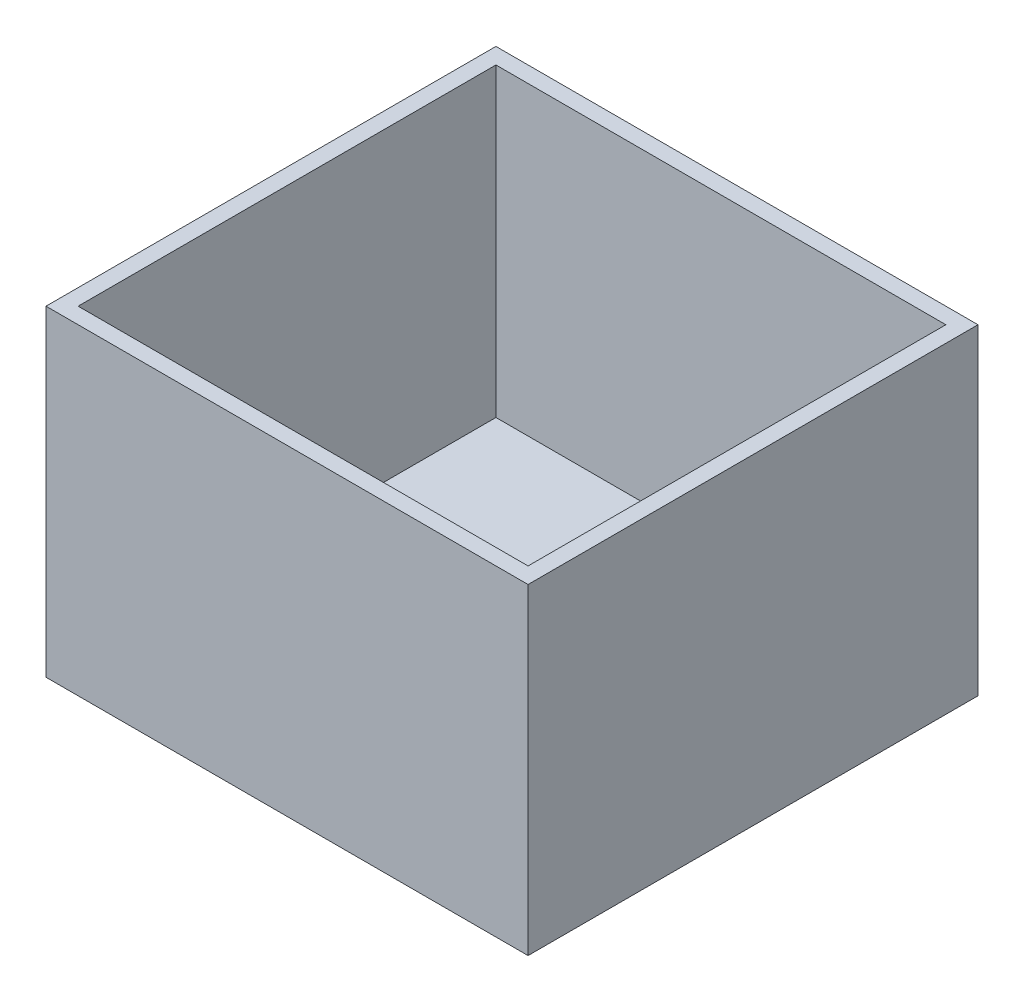
ISO-10303-21;
HEADER;
FILE_DESCRIPTION(('STEP AP214'),'2;1');
FILE_NAME('part.step','',(''),(''),'','','');
FILE_SCHEMA(('AUTOMOTIVE_DESIGN { 1 0 10303 214 1 1 1 1 }'));
ENDSEC;
DATA;
#1=APPLICATION_CONTEXT('core data for automotive mechanical design processes');
#2=APPLICATION_PROTOCOL_DEFINITION('international standard','automotive_design',2000,#1);
#3=PRODUCT_CONTEXT('',#1,'mechanical');
#4=PRODUCT('Part','Part','',(#3));
#5=PRODUCT_RELATED_PRODUCT_CATEGORY('part','',(#4));
#6=PRODUCT_DEFINITION_FORMATION('','',#4);
#7=PRODUCT_DEFINITION_CONTEXT('part definition',#1,'design');
#8=PRODUCT_DEFINITION('design','',#6,#7);
#9=PRODUCT_DEFINITION_SHAPE('','',#8);
#10=(LENGTH_UNIT() NAMED_UNIT(*) SI_UNIT(.MILLI.,.METRE.));
#11=(NAMED_UNIT(*) PLANE_ANGLE_UNIT() SI_UNIT($,.RADIAN.));
#12=(NAMED_UNIT(*) SI_UNIT($,.STERADIAN.) SOLID_ANGLE_UNIT());
#13=UNCERTAINTY_MEASURE_WITH_UNIT(LENGTH_MEASURE(1.E-05),#10,'distance_accuracy_value','');
#14=(GEOMETRIC_REPRESENTATION_CONTEXT(3) GLOBAL_UNCERTAINTY_ASSIGNED_CONTEXT((#13)) GLOBAL_UNIT_ASSIGNED_CONTEXT((#10,
#11,#12)) REPRESENTATION_CONTEXT('',''));
#15=CARTESIAN_POINT('',(0.,0.,0.));
#16=DIRECTION('',(0.,0.,1.));
#17=DIRECTION('',(1.,0.,0.));
#18=AXIS2_PLACEMENT_3D('',#15,#16,#17);
#19=CARTESIAN_POINT('',(0.,25.4,0.));
#20=DIRECTION('',(0.,1.,0.));
#21=DIRECTION('',(0.,0.,1.));
#22=AXIS2_PLACEMENT_3D('',#19,#20,#21);
#23=PLANE('',#22);
#24=DIRECTION('',(1.,0.,0.));
#25=VECTOR('',#24,1.);
#26=CARTESIAN_POINT('',(0.,25.4,-35.56));
#27=LINE('',#26,#25);
#28=CARTESIAN_POINT('',(-38.1,25.4,-35.56));
#29=VERTEX_POINT('',#28);
#30=CARTESIAN_POINT('',(38.1,25.4,-35.56));
#31=VERTEX_POINT('',#30);
#32=EDGE_CURVE('E172',#29,#31,#27,.T.);
#33=ORIENTED_EDGE('',*,*,#32,.F.);
#34=DIRECTION('',(0.,0.,1.));
#35=VECTOR('',#34,1.);
#36=CARTESIAN_POINT('',(-38.1,25.4,0.));
#37=LINE('',#36,#35);
#38=CARTESIAN_POINT('',(-38.1,25.4,35.56));
#39=VERTEX_POINT('',#38);
#40=EDGE_CURVE('E175',#29,#39,#37,.T.);
#41=ORIENTED_EDGE('',*,*,#40,.T.);
#42=DIRECTION('',(-1.,0.,0.));
#43=VECTOR('',#42,1.);
#44=CARTESIAN_POINT('',(0.,25.4,35.56));
#45=LINE('',#44,#43);
#46=CARTESIAN_POINT('',(38.1,25.4,35.56));
#47=VERTEX_POINT('',#46);
#48=EDGE_CURVE('E179',#47,#39,#45,.T.);
#49=ORIENTED_EDGE('',*,*,#48,.F.);
#50=DIRECTION('',(0.,0.,1.));
#51=VECTOR('',#50,1.);
#52=CARTESIAN_POINT('',(38.1,25.4,0.));
#53=LINE('',#52,#51);
#54=EDGE_CURVE('E183',#31,#47,#53,.T.);
#55=ORIENTED_EDGE('',*,*,#54,.F.);
#56=EDGE_LOOP('',(#33,#41,#49,#55));
#57=FACE_BOUND('',#56,.T.);
#58=DIRECTION('',(0.,0.,1.));
#59=VECTOR('',#58,1.);
#60=CARTESIAN_POINT('',(-35.56,25.4,0.));
#61=LINE('',#60,#59);
#62=CARTESIAN_POINT('',(-35.56,25.4,-33.02));
#63=VERTEX_POINT('',#62);
#64=CARTESIAN_POINT('',(-35.56,25.4,33.02));
#65=VERTEX_POINT('',#64);
#66=EDGE_CURVE('E164',#63,#65,#61,.T.);
#67=ORIENTED_EDGE('',*,*,#66,.F.);
#68=DIRECTION('',(1.,0.,0.));
#69=VECTOR('',#68,1.);
#70=CARTESIAN_POINT('',(0.,25.4,-33.02));
#71=LINE('',#70,#69);
#72=CARTESIAN_POINT('',(35.56,25.4,-33.02));
#73=VERTEX_POINT('',#72);
#74=EDGE_CURVE('E127',#63,#73,#71,.T.);
#75=ORIENTED_EDGE('',*,*,#74,.T.);
#76=DIRECTION('',(0.,0.,1.));
#77=VECTOR('',#76,1.);
#78=CARTESIAN_POINT('',(35.56,25.4,0.));
#79=LINE('',#78,#77);
#80=CARTESIAN_POINT('',(35.56,25.4,33.02));
#81=VERTEX_POINT('',#80);
#82=EDGE_CURVE('E152',#73,#81,#79,.T.);
#83=ORIENTED_EDGE('',*,*,#82,.T.);
#84=DIRECTION('',(-1.,0.,0.));
#85=VECTOR('',#84,1.);
#86=CARTESIAN_POINT('',(0.,25.4,33.02));
#87=LINE('',#86,#85);
#88=EDGE_CURVE('E65',#81,#65,#87,.T.);
#89=ORIENTED_EDGE('',*,*,#88,.T.);
#90=EDGE_LOOP('',(#67,#75,#83,#89));
#91=FACE_BOUND('',#90,.T.);
#92=ADVANCED_FACE('F49',(#57,#91),#23,.T.);
#93=CARTESIAN_POINT('',(0.,25.4,-35.56));
#94=DIRECTION('',(0.,0.,-1.));
#95=DIRECTION('',(-1.,0.,0.));
#96=AXIS2_PLACEMENT_3D('',#93,#94,#95);
#97=PLANE('',#96);
#98=DIRECTION('',(1.,0.,0.));
#99=VECTOR('',#98,1.);
#100=CARTESIAN_POINT('',(0.,-25.4,-35.56));
#101=LINE('',#100,#99);
#102=CARTESIAN_POINT('',(-38.1,-25.4,-35.56));
#103=VERTEX_POINT('',#102);
#104=CARTESIAN_POINT('',(38.1,-25.4,-35.56));
#105=VERTEX_POINT('',#104);
#106=EDGE_CURVE('E131',#103,#105,#101,.T.);
#107=ORIENTED_EDGE('',*,*,#106,.F.);
#108=DIRECTION('',(0.,-1.,0.));
#109=VECTOR('',#108,1.);
#110=CARTESIAN_POINT('',(-38.1,25.4,-35.56));
#111=LINE('',#110,#109);
#112=EDGE_CURVE('E11',#29,#103,#111,.T.);
#113=ORIENTED_EDGE('',*,*,#112,.F.);
#114=ORIENTED_EDGE('',*,*,#32,.T.);
#115=DIRECTION('',(0.,-1.,0.));
#116=VECTOR('',#115,1.);
#117=CARTESIAN_POINT('',(38.1,25.4,-35.56));
#118=LINE('',#117,#116);
#119=EDGE_CURVE('E74',#31,#105,#118,.T.);
#120=ORIENTED_EDGE('',*,*,#119,.T.);
#121=EDGE_LOOP('',(#107,#113,#114,#120));
#122=FACE_BOUND('',#121,.T.);
#123=ADVANCED_FACE('F51',(#122),#97,.T.);
#124=CARTESIAN_POINT('',(-38.1,25.4,0.));
#125=DIRECTION('',(1.,0.,0.));
#126=DIRECTION('',(0.,0.,-1.));
#127=AXIS2_PLACEMENT_3D('',#124,#125,#126);
#128=PLANE('',#127);
#129=DIRECTION('',(0.,0.,1.));
#130=VECTOR('',#129,1.);
#131=CARTESIAN_POINT('',(-38.1,-25.4,0.));
#132=LINE('',#131,#130);
#133=CARTESIAN_POINT('',(-38.1,-25.4,35.56));
#134=VERTEX_POINT('',#133);
#135=EDGE_CURVE('E188',#103,#134,#132,.T.);
#136=ORIENTED_EDGE('',*,*,#135,.T.);
#137=DIRECTION('',(0.,-1.,0.));
#138=VECTOR('',#137,1.);
#139=CARTESIAN_POINT('',(-38.1,25.4,35.56));
#140=LINE('',#139,#138);
#141=EDGE_CURVE('E58',#39,#134,#140,.T.);
#142=ORIENTED_EDGE('',*,*,#141,.F.);
#143=ORIENTED_EDGE('',*,*,#40,.F.);
#144=ORIENTED_EDGE('',*,*,#112,.T.);
#145=EDGE_LOOP('',(#136,#142,#143,#144));
#146=FACE_BOUND('',#145,.T.);
#147=ADVANCED_FACE('F211',(#146),#128,.F.);
#148=CARTESIAN_POINT('',(0.,25.4,35.56));
#149=DIRECTION('',(0.,0.,1.));
#150=DIRECTION('',(1.,0.,0.));
#151=AXIS2_PLACEMENT_3D('',#148,#149,#150);
#152=PLANE('',#151);
#153=DIRECTION('',(-1.,0.,0.));
#154=VECTOR('',#153,1.);
#155=CARTESIAN_POINT('',(0.,-25.4,35.56));
#156=LINE('',#155,#154);
#157=CARTESIAN_POINT('',(38.1,-25.4,35.56));
#158=VERTEX_POINT('',#157);
#159=EDGE_CURVE('E192',#158,#134,#156,.T.);
#160=ORIENTED_EDGE('',*,*,#159,.F.);
#161=DIRECTION('',(0.,-1.,0.));
#162=VECTOR('',#161,1.);
#163=CARTESIAN_POINT('',(38.1,25.4,35.56));
#164=LINE('',#163,#162);
#165=EDGE_CURVE('E201',#47,#158,#164,.T.);
#166=ORIENTED_EDGE('',*,*,#165,.F.);
#167=ORIENTED_EDGE('',*,*,#48,.T.);
#168=ORIENTED_EDGE('',*,*,#141,.T.);
#169=EDGE_LOOP('',(#160,#166,#167,#168));
#170=FACE_BOUND('',#169,.T.);
#171=ADVANCED_FACE('F207',(#170),#152,.T.);
#172=CARTESIAN_POINT('',(38.1,25.4,0.));
#173=DIRECTION('',(1.,0.,0.));
#174=DIRECTION('',(0.,0.,-1.));
#175=AXIS2_PLACEMENT_3D('',#172,#173,#174);
#176=PLANE('',#175);
#177=DIRECTION('',(0.,0.,1.));
#178=VECTOR('',#177,1.);
#179=CARTESIAN_POINT('',(38.1,-25.4,0.));
#180=LINE('',#179,#178);
#181=EDGE_CURVE('E176',#105,#158,#180,.T.);
#182=ORIENTED_EDGE('',*,*,#181,.F.);
#183=ORIENTED_EDGE('',*,*,#119,.F.);
#184=ORIENTED_EDGE('',*,*,#54,.T.);
#185=ORIENTED_EDGE('',*,*,#165,.T.);
#186=EDGE_LOOP('',(#182,#183,#184,#185));
#187=FACE_BOUND('',#186,.T.);
#188=ADVANCED_FACE('F214',(#187),#176,.T.);
#189=CARTESIAN_POINT('',(0.,-25.4,0.));
#190=DIRECTION('',(0.,1.,0.));
#191=DIRECTION('',(0.,0.,1.));
#192=AXIS2_PLACEMENT_3D('',#189,#190,#191);
#193=PLANE('',#192);
#194=ORIENTED_EDGE('',*,*,#106,.T.);
#195=ORIENTED_EDGE('',*,*,#181,.T.);
#196=ORIENTED_EDGE('',*,*,#159,.T.);
#197=ORIENTED_EDGE('',*,*,#135,.F.);
#198=EDGE_LOOP('',(#194,#195,#196,#197));
#199=FACE_BOUND('',#198,.T.);
#200=ADVANCED_FACE('F213',(#199),#193,.F.);
#201=CARTESIAN_POINT('',(0.,25.4,-33.02));
#202=DIRECTION('',(0.,0.,-1.));
#203=DIRECTION('',(-1.,0.,0.));
#204=AXIS2_PLACEMENT_3D('',#201,#202,#203);
#205=PLANE('',#204);
#206=DIRECTION('',(1.,0.,0.));
#207=VECTOR('',#206,1.);
#208=CARTESIAN_POINT('',(0.,-22.86,-33.02));
#209=LINE('',#208,#207);
#210=CARTESIAN_POINT('',(-35.56,-22.86,-33.02));
#211=VERTEX_POINT('',#210);
#212=CARTESIAN_POINT('',(35.56,-22.86,-33.02));
#213=VERTEX_POINT('',#212);
#214=EDGE_CURVE('E124',#211,#213,#209,.T.);
#215=ORIENTED_EDGE('',*,*,#214,.T.);
#216=DIRECTION('',(0.,-1.,0.));
#217=VECTOR('',#216,1.);
#218=CARTESIAN_POINT('',(35.56,25.4,-33.02));
#219=LINE('',#218,#217);
#220=EDGE_CURVE('E149',#73,#213,#219,.T.);
#221=ORIENTED_EDGE('',*,*,#220,.F.);
#222=ORIENTED_EDGE('',*,*,#74,.F.);
#223=DIRECTION('',(0.,-1.,0.));
#224=VECTOR('',#223,1.);
#225=CARTESIAN_POINT('',(-35.56,25.4,-33.02));
#226=LINE('',#225,#224);
#227=EDGE_CURVE('E120',#63,#211,#226,.T.);
#228=ORIENTED_EDGE('',*,*,#227,.T.);
#229=EDGE_LOOP('',(#215,#221,#222,#228));
#230=FACE_BOUND('',#229,.T.);
#231=ADVANCED_FACE('F122',(#230),#205,.F.);
#232=CARTESIAN_POINT('',(-35.56,25.4,0.));
#233=DIRECTION('',(1.,0.,0.));
#234=DIRECTION('',(0.,0.,-1.));
#235=AXIS2_PLACEMENT_3D('',#232,#233,#234);
#236=PLANE('',#235);
#237=DIRECTION('',(0.,0.,1.));
#238=VECTOR('',#237,1.);
#239=CARTESIAN_POINT('',(-35.56,-22.86,0.));
#240=LINE('',#239,#238);
#241=CARTESIAN_POINT('',(-35.56,-22.86,33.02));
#242=VERTEX_POINT('',#241);
#243=EDGE_CURVE('E135',#211,#242,#240,.T.);
#244=ORIENTED_EDGE('',*,*,#243,.F.);
#245=ORIENTED_EDGE('',*,*,#227,.F.);
#246=ORIENTED_EDGE('',*,*,#66,.T.);
#247=DIRECTION('',(0.,-1.,0.));
#248=VECTOR('',#247,1.);
#249=CARTESIAN_POINT('',(-35.56,25.4,33.02));
#250=LINE('',#249,#248);
#251=EDGE_CURVE('E132',#65,#242,#250,.T.);
#252=ORIENTED_EDGE('',*,*,#251,.T.);
#253=EDGE_LOOP('',(#244,#245,#246,#252));
#254=FACE_BOUND('',#253,.T.);
#255=ADVANCED_FACE('F136',(#254),#236,.T.);
#256=CARTESIAN_POINT('',(0.,25.4,33.02));
#257=DIRECTION('',(0.,0.,1.));
#258=DIRECTION('',(1.,0.,0.));
#259=AXIS2_PLACEMENT_3D('',#256,#257,#258);
#260=PLANE('',#259);
#261=DIRECTION('',(-1.,0.,0.));
#262=VECTOR('',#261,1.);
#263=CARTESIAN_POINT('',(0.,-22.86,33.02));
#264=LINE('',#263,#262);
#265=CARTESIAN_POINT('',(35.56,-22.86,33.02));
#266=VERTEX_POINT('',#265);
#267=EDGE_CURVE('E141',#266,#242,#264,.T.);
#268=ORIENTED_EDGE('',*,*,#267,.T.);
#269=ORIENTED_EDGE('',*,*,#251,.F.);
#270=ORIENTED_EDGE('',*,*,#88,.F.);
#271=DIRECTION('',(0.,-1.,0.));
#272=VECTOR('',#271,1.);
#273=CARTESIAN_POINT('',(35.56,25.4,33.02));
#274=LINE('',#273,#272);
#275=EDGE_CURVE('E151',#81,#266,#274,.T.);
#276=ORIENTED_EDGE('',*,*,#275,.T.);
#277=EDGE_LOOP('',(#268,#269,#270,#276));
#278=FACE_BOUND('',#277,.T.);
#279=ADVANCED_FACE('F278',(#278),#260,.F.);
#280=CARTESIAN_POINT('',(35.56,25.4,0.));
#281=DIRECTION('',(1.,0.,0.));
#282=DIRECTION('',(0.,0.,-1.));
#283=AXIS2_PLACEMENT_3D('',#280,#281,#282);
#284=PLANE('',#283);
#285=DIRECTION('',(0.,0.,1.));
#286=VECTOR('',#285,1.);
#287=CARTESIAN_POINT('',(35.56,-22.86,0.));
#288=LINE('',#287,#286);
#289=EDGE_CURVE('E145',#213,#266,#288,.T.);
#290=ORIENTED_EDGE('',*,*,#289,.T.);
#291=ORIENTED_EDGE('',*,*,#275,.F.);
#292=ORIENTED_EDGE('',*,*,#82,.F.);
#293=ORIENTED_EDGE('',*,*,#220,.T.);
#294=EDGE_LOOP('',(#290,#291,#292,#293));
#295=FACE_BOUND('',#294,.T.);
#296=ADVANCED_FACE('F290',(#295),#284,.F.);
#297=CARTESIAN_POINT('',(0.,-22.86,0.));
#298=DIRECTION('',(0.,1.,0.));
#299=DIRECTION('',(0.,0.,1.));
#300=AXIS2_PLACEMENT_3D('',#297,#298,#299);
#301=PLANE('',#300);
#302=ORIENTED_EDGE('',*,*,#214,.F.);
#303=ORIENTED_EDGE('',*,*,#243,.T.);
#304=ORIENTED_EDGE('',*,*,#267,.F.);
#305=ORIENTED_EDGE('',*,*,#289,.F.);
#306=EDGE_LOOP('',(#302,#303,#304,#305));
#307=FACE_BOUND('',#306,.T.);
#308=ADVANCED_FACE('F143',(#307),#301,.T.);
#309=CLOSED_SHELL('',(#92,#123,#147,#171,#188,#200,#231,#255,#279,#296,#308));
#310=MANIFOLD_SOLID_BREP('B2',#309);
#311=ADVANCED_BREP_SHAPE_REPRESENTATION('',(#18,#310),#14);
#312=SHAPE_DEFINITION_REPRESENTATION(#9,#311);
ENDSEC;
END-ISO-10303-21;
